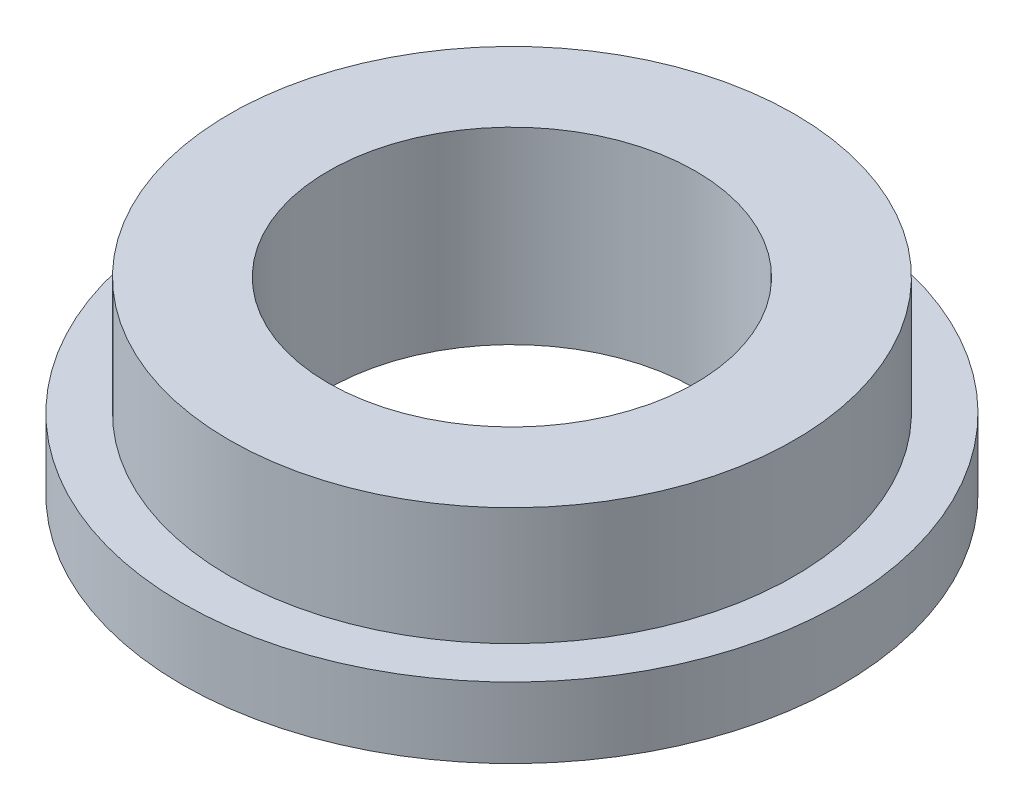
ISO-10303-21;
HEADER;
FILE_DESCRIPTION(('STEP AP214'),'2;1');
FILE_NAME('part.step','',(''),(''),'','','');
FILE_SCHEMA(('AUTOMOTIVE_DESIGN { 1 0 10303 214 1 1 1 1 }'));
ENDSEC;
DATA;
#1=APPLICATION_CONTEXT('core data for automotive mechanical design processes');
#2=APPLICATION_PROTOCOL_DEFINITION('international standard','automotive_design',2000,#1);
#3=PRODUCT_CONTEXT('',#1,'mechanical');
#4=PRODUCT('Part','Part','',(#3));
#5=PRODUCT_RELATED_PRODUCT_CATEGORY('part','',(#4));
#6=PRODUCT_DEFINITION_FORMATION('','',#4);
#7=PRODUCT_DEFINITION_CONTEXT('part definition',#1,'design');
#8=PRODUCT_DEFINITION('design','',#6,#7);
#9=PRODUCT_DEFINITION_SHAPE('','',#8);
#10=(LENGTH_UNIT() NAMED_UNIT(*) SI_UNIT(.MILLI.,.METRE.));
#11=(NAMED_UNIT(*) PLANE_ANGLE_UNIT() SI_UNIT($,.RADIAN.));
#12=(NAMED_UNIT(*) SI_UNIT($,.STERADIAN.) SOLID_ANGLE_UNIT());
#13=UNCERTAINTY_MEASURE_WITH_UNIT(LENGTH_MEASURE(1.E-05),#10,'distance_accuracy_value','');
#14=(GEOMETRIC_REPRESENTATION_CONTEXT(3) GLOBAL_UNCERTAINTY_ASSIGNED_CONTEXT((#13)) GLOBAL_UNIT_ASSIGNED_CONTEXT((#10,
#11,#12)) REPRESENTATION_CONTEXT('',''));
#15=CARTESIAN_POINT('',(0.,0.,0.));
#16=DIRECTION('',(0.,0.,1.));
#17=DIRECTION('',(1.,0.,0.));
#18=AXIS2_PLACEMENT_3D('',#15,#16,#17);
#19=CARTESIAN_POINT('',(-171.12047620144,-92.0731608386666,270.177536173505));
#20=DIRECTION('',(0.,-1.,0.));
#21=DIRECTION('',(0.,0.,-1.));
#22=AXIS2_PLACEMENT_3D('',#19,#20,#21);
#23=CYLINDRICAL_SURFACE('',#22,7.);
#24=CARTESIAN_POINT('',(-171.12047620144,-92.0731608386666,270.177536173505));
#25=DIRECTION('',(0.,1.,0.));
#26=DIRECTION('',(0.,0.,1.));
#27=AXIS2_PLACEMENT_3D('',#24,#25,#26);
#28=CIRCLE('',#27,7.);
#29=CARTESIAN_POINT('',(-171.12047620144,-92.0731608386666,277.177536173505));
#30=VERTEX_POINT('',#29);
#31=EDGE_CURVE('E39',#30,#30,#28,.T.);
#32=ORIENTED_EDGE('',*,*,#31,.F.);
#33=EDGE_LOOP('',(#32));
#34=FACE_BOUND('',#33,.T.);
#35=CARTESIAN_POINT('',(-171.12047620144,-93.5731608386666,270.177536173505));
#36=DIRECTION('',(0.,1.,0.));
#37=DIRECTION('',(0.,0.,1.));
#38=AXIS2_PLACEMENT_3D('',#35,#36,#37);
#39=CIRCLE('',#38,7.);
#40=CARTESIAN_POINT('',(-171.12047620144,-93.5731608386666,277.177536173505));
#41=VERTEX_POINT('',#40);
#42=EDGE_CURVE('E35',#41,#41,#39,.T.);
#43=ORIENTED_EDGE('',*,*,#42,.T.);
#44=EDGE_LOOP('',(#43));
#45=FACE_BOUND('',#44,.T.);
#46=ADVANCED_FACE('F32',(#34,#45),#23,.T.);
#47=CARTESIAN_POINT('',(-171.12047620144,-92.0731608386666,270.177536173505));
#48=DIRECTION('',(0.,1.,0.));
#49=DIRECTION('',(0.,0.,1.));
#50=AXIS2_PLACEMENT_3D('',#47,#48,#49);
#51=PLANE('',#50);
#52=CARTESIAN_POINT('',(-171.12047620144,-92.0731608386666,270.177536173505));
#53=DIRECTION('',(0.,1.,0.));
#54=DIRECTION('',(0.,0.,1.));
#55=AXIS2_PLACEMENT_3D('',#52,#53,#54);
#56=CIRCLE('',#55,6.);
#57=CARTESIAN_POINT('',(-171.12047620144,-92.0731608386666,276.177536173505));
#58=VERTEX_POINT('',#57);
#59=EDGE_CURVE('E10',#58,#58,#56,.T.);
#60=ORIENTED_EDGE('',*,*,#59,.F.);
#61=EDGE_LOOP('',(#60));
#62=FACE_BOUND('',#61,.T.);
#63=ORIENTED_EDGE('',*,*,#31,.T.);
#64=EDGE_LOOP('',(#63));
#65=FACE_BOUND('',#64,.T.);
#66=ADVANCED_FACE('F76',(#62,#65),#51,.T.);
#67=CARTESIAN_POINT('',(-171.12047620144,-93.5731608386666,270.177536173505));
#68=DIRECTION('',(0.,1.,0.));
#69=DIRECTION('',(0.,0.,1.));
#70=AXIS2_PLACEMENT_3D('',#67,#68,#69);
#71=PLANE('',#70);
#72=CARTESIAN_POINT('',(-171.12047620144,-93.5731608386666,270.177536173505));
#73=DIRECTION('',(0.,1.,0.));
#74=DIRECTION('',(0.,0.,1.));
#75=AXIS2_PLACEMENT_3D('',#72,#73,#74);
#76=CIRCLE('',#75,3.9);
#77=CARTESIAN_POINT('',(-171.12047620144,-93.5731608386666,274.077536173505));
#78=VERTEX_POINT('',#77);
#79=EDGE_CURVE('E48',#78,#78,#76,.T.);
#80=ORIENTED_EDGE('',*,*,#79,.T.);
#81=EDGE_LOOP('',(#80));
#82=FACE_BOUND('',#81,.T.);
#83=ORIENTED_EDGE('',*,*,#42,.F.);
#84=EDGE_LOOP('',(#83));
#85=FACE_BOUND('',#84,.T.);
#86=ADVANCED_FACE('F55',(#82,#85),#71,.F.);
#87=CARTESIAN_POINT('',(-171.12047620144,-89.5731608386666,270.177536173505));
#88=DIRECTION('',(0.,-1.,0.));
#89=DIRECTION('',(0.,0.,-1.));
#90=AXIS2_PLACEMENT_3D('',#87,#88,#89);
#91=CYLINDRICAL_SURFACE('',#90,6.);
#92=CARTESIAN_POINT('',(-171.12047620144,-89.5731608386666,270.177536173505));
#93=DIRECTION('',(0.,1.,0.));
#94=DIRECTION('',(0.,0.,1.));
#95=AXIS2_PLACEMENT_3D('',#92,#93,#94);
#96=CIRCLE('',#95,6.);
#97=CARTESIAN_POINT('',(-171.12047620144,-89.5731608386666,276.177536173505));
#98=VERTEX_POINT('',#97);
#99=EDGE_CURVE('E45',#98,#98,#96,.T.);
#100=ORIENTED_EDGE('',*,*,#99,.F.);
#101=EDGE_LOOP('',(#100));
#102=FACE_BOUND('',#101,.T.);
#103=ORIENTED_EDGE('',*,*,#59,.T.);
#104=EDGE_LOOP('',(#103));
#105=FACE_BOUND('',#104,.T.);
#106=ADVANCED_FACE('F67',(#102,#105),#91,.T.);
#107=CARTESIAN_POINT('',(-171.12047620144,-89.5731608386666,270.177536173505));
#108=DIRECTION('',(0.,1.,0.));
#109=DIRECTION('',(0.,0.,1.));
#110=AXIS2_PLACEMENT_3D('',#107,#108,#109);
#111=PLANE('',#110);
#112=CARTESIAN_POINT('',(-171.12047620144,-89.5731608386666,270.177536173505));
#113=DIRECTION('',(0.,1.,0.));
#114=DIRECTION('',(0.,0.,1.));
#115=AXIS2_PLACEMENT_3D('',#112,#113,#114);
#116=CIRCLE('',#115,3.9);
#117=CARTESIAN_POINT('',(-171.12047620144,-89.5731608386666,274.077536173505));
#118=VERTEX_POINT('',#117);
#119=EDGE_CURVE('E49',#118,#118,#116,.T.);
#120=ORIENTED_EDGE('',*,*,#119,.F.);
#121=EDGE_LOOP('',(#120));
#122=FACE_BOUND('',#121,.T.);
#123=ORIENTED_EDGE('',*,*,#99,.T.);
#124=EDGE_LOOP('',(#123));
#125=FACE_BOUND('',#124,.T.);
#126=ADVANCED_FACE('F61',(#122,#125),#111,.T.);
#127=CARTESIAN_POINT('',(-171.12047620144,-93.5731608386666,270.177536173505));
#128=DIRECTION('',(0.,1.,0.));
#129=DIRECTION('',(0.,0.,1.));
#130=AXIS2_PLACEMENT_3D('',#127,#128,#129);
#131=CYLINDRICAL_SURFACE('',#130,3.9);
#132=ORIENTED_EDGE('',*,*,#79,.F.);
#133=EDGE_LOOP('',(#132));
#134=FACE_BOUND('',#133,.T.);
#135=ORIENTED_EDGE('',*,*,#119,.T.);
#136=EDGE_LOOP('',(#135));
#137=FACE_BOUND('',#136,.T.);
#138=ADVANCED_FACE('F58',(#134,#137),#131,.F.);
#139=CLOSED_SHELL('',(#46,#66,#86,#106,#126,#138));
#140=MANIFOLD_SOLID_BREP('B2',#139);
#141=ADVANCED_BREP_SHAPE_REPRESENTATION('',(#18,#140),#14);
#142=SHAPE_DEFINITION_REPRESENTATION(#9,#141);
ENDSEC;
END-ISO-10303-21;
